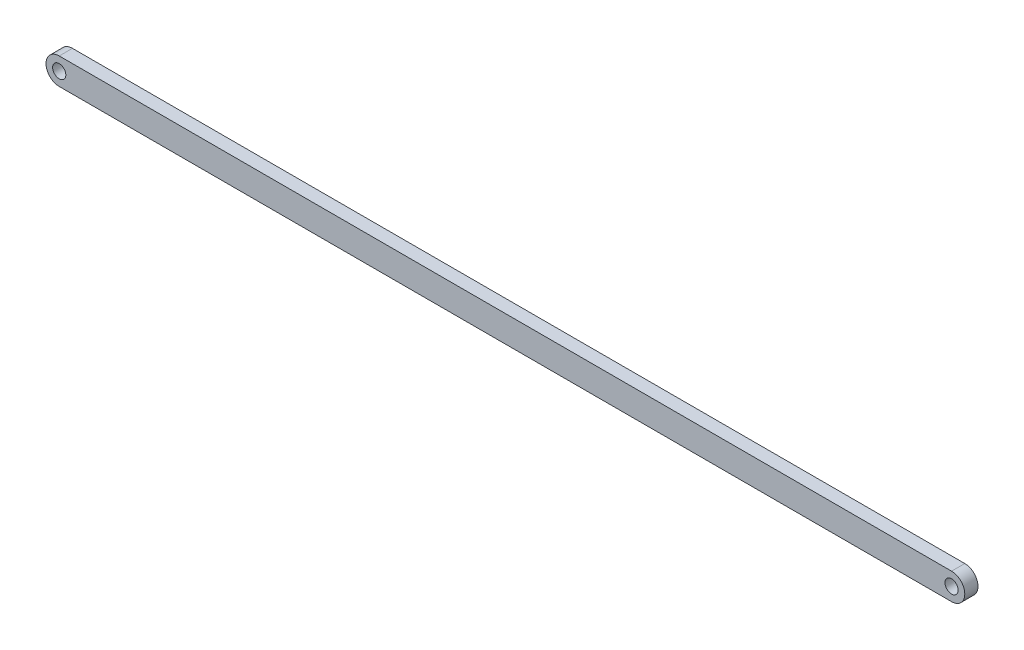
ISO-10303-21;
HEADER;
FILE_DESCRIPTION(('STEP AP214'),'2;1');
FILE_NAME('part.step','',(''),(''),'','','');
FILE_SCHEMA(('AUTOMOTIVE_DESIGN { 1 0 10303 214 1 1 1 1 }'));
ENDSEC;
DATA;
#1=APPLICATION_CONTEXT('core data for automotive mechanical design processes');
#2=APPLICATION_PROTOCOL_DEFINITION('international standard','automotive_design',2000,#1);
#3=PRODUCT_CONTEXT('',#1,'mechanical');
#4=PRODUCT('Part','Part','',(#3));
#5=PRODUCT_RELATED_PRODUCT_CATEGORY('part','',(#4));
#6=PRODUCT_DEFINITION_FORMATION('','',#4);
#7=PRODUCT_DEFINITION_CONTEXT('part definition',#1,'design');
#8=PRODUCT_DEFINITION('design','',#6,#7);
#9=PRODUCT_DEFINITION_SHAPE('','',#8);
#10=(LENGTH_UNIT() NAMED_UNIT(*) SI_UNIT(.MILLI.,.METRE.));
#11=(NAMED_UNIT(*) PLANE_ANGLE_UNIT() SI_UNIT($,.RADIAN.));
#12=(NAMED_UNIT(*) SI_UNIT($,.STERADIAN.) SOLID_ANGLE_UNIT());
#13=UNCERTAINTY_MEASURE_WITH_UNIT(LENGTH_MEASURE(1.E-05),#10,'distance_accuracy_value','');
#14=(GEOMETRIC_REPRESENTATION_CONTEXT(3) GLOBAL_UNCERTAINTY_ASSIGNED_CONTEXT((#13)) GLOBAL_UNIT_ASSIGNED_CONTEXT((#10,
#11,#12)) REPRESENTATION_CONTEXT('',''));
#15=CARTESIAN_POINT('',(0.,0.,0.));
#16=DIRECTION('',(0.,0.,1.));
#17=DIRECTION('',(1.,0.,0.));
#18=AXIS2_PLACEMENT_3D('',#15,#16,#17);
#19=CARTESIAN_POINT('',(168.72,0.,5.));
#20=DIRECTION('',(0.,0.,-1.));
#21=DIRECTION('',(-1.,0.,0.));
#22=AXIS2_PLACEMENT_3D('',#19,#20,#21);
#23=PLANE('',#22);
#24=CARTESIAN_POINT('',(168.72,0.,5.));
#25=DIRECTION('',(0.,0.,1.));
#26=DIRECTION('',(-1.,0.,0.));
#27=AXIS2_PLACEMENT_3D('',#24,#25,#26);
#28=CIRCLE('',#27,5.);
#29=CARTESIAN_POINT('',(168.72,-5.,5.));
#30=VERTEX_POINT('',#29);
#31=CARTESIAN_POINT('',(168.72,5.,5.));
#32=VERTEX_POINT('',#31);
#33=EDGE_CURVE('E96',#30,#32,#28,.T.);
#34=ORIENTED_EDGE('',*,*,#33,.T.);
#35=DIRECTION('',(-1.,0.,0.));
#36=VECTOR('',#35,1.);
#37=CARTESIAN_POINT('',(-168.72,5.,5.));
#38=LINE('',#37,#36);
#39=CARTESIAN_POINT('',(-168.72,5.,5.));
#40=VERTEX_POINT('',#39);
#41=EDGE_CURVE('E91',#32,#40,#38,.T.);
#42=ORIENTED_EDGE('',*,*,#41,.T.);
#43=CARTESIAN_POINT('',(-168.72,0.,5.));
#44=DIRECTION('',(0.,0.,1.));
#45=DIRECTION('',(1.,0.,0.));
#46=AXIS2_PLACEMENT_3D('',#43,#44,#45);
#47=CIRCLE('',#46,5.);
#48=CARTESIAN_POINT('',(-168.72,-5.,5.));
#49=VERTEX_POINT('',#48);
#50=EDGE_CURVE('E94',#40,#49,#47,.T.);
#51=ORIENTED_EDGE('',*,*,#50,.T.);
#52=DIRECTION('',(1.,0.,0.));
#53=VECTOR('',#52,1.);
#54=CARTESIAN_POINT('',(-168.72,-5.,5.));
#55=LINE('',#54,#53);
#56=EDGE_CURVE('E61',#49,#30,#55,.T.);
#57=ORIENTED_EDGE('',*,*,#56,.T.);
#58=EDGE_LOOP('',(#34,#42,#51,#57));
#59=FACE_BOUND('',#58,.T.);
#60=CARTESIAN_POINT('',(-168.72,0.,5.));
#61=DIRECTION('',(0.,0.,1.));
#62=DIRECTION('',(1.,0.,0.));
#63=AXIS2_PLACEMENT_3D('',#60,#61,#62);
#64=CIRCLE('',#63,2.5);
#65=CARTESIAN_POINT('',(-166.22,0.,5.));
#66=VERTEX_POINT('',#65);
#67=EDGE_CURVE('E116',#66,#66,#64,.T.);
#68=ORIENTED_EDGE('',*,*,#67,.F.);
#69=EDGE_LOOP('',(#68));
#70=FACE_BOUND('',#69,.T.);
#71=CARTESIAN_POINT('',(168.72,0.,5.));
#72=DIRECTION('',(0.,0.,1.));
#73=DIRECTION('',(1.,0.,0.));
#74=AXIS2_PLACEMENT_3D('',#71,#72,#73);
#75=CIRCLE('',#74,2.5);
#76=CARTESIAN_POINT('',(171.22,0.,5.));
#77=VERTEX_POINT('',#76);
#78=EDGE_CURVE('E138',#77,#77,#75,.T.);
#79=ORIENTED_EDGE('',*,*,#78,.F.);
#80=EDGE_LOOP('',(#79));
#81=FACE_BOUND('',#80,.T.);
#82=ADVANCED_FACE('F43',(#59,#70,#81),#23,.F.);
#83=CARTESIAN_POINT('',(168.72,0.,0.));
#84=DIRECTION('',(0.,0.,-1.));
#85=DIRECTION('',(-1.,0.,0.));
#86=AXIS2_PLACEMENT_3D('',#83,#84,#85);
#87=PLANE('',#86);
#88=CARTESIAN_POINT('',(-168.72,0.,0.));
#89=DIRECTION('',(0.,0.,1.));
#90=DIRECTION('',(1.,0.,0.));
#91=AXIS2_PLACEMENT_3D('',#88,#89,#90);
#92=CIRCLE('',#91,2.5);
#93=CARTESIAN_POINT('',(-166.22,0.,0.));
#94=VERTEX_POINT('',#93);
#95=EDGE_CURVE('E134',#94,#94,#92,.T.);
#96=ORIENTED_EDGE('',*,*,#95,.T.);
#97=EDGE_LOOP('',(#96));
#98=FACE_BOUND('',#97,.T.);
#99=CARTESIAN_POINT('',(168.72,0.,0.));
#100=DIRECTION('',(0.,0.,1.));
#101=DIRECTION('',(-1.,0.,0.));
#102=AXIS2_PLACEMENT_3D('',#99,#100,#101);
#103=CIRCLE('',#102,5.);
#104=CARTESIAN_POINT('',(168.72,-5.,0.));
#105=VERTEX_POINT('',#104);
#106=CARTESIAN_POINT('',(168.72,5.,0.));
#107=VERTEX_POINT('',#106);
#108=EDGE_CURVE('E112',#105,#107,#103,.T.);
#109=ORIENTED_EDGE('',*,*,#108,.F.);
#110=DIRECTION('',(1.,0.,0.));
#111=VECTOR('',#110,1.);
#112=CARTESIAN_POINT('',(-168.72,-5.,0.));
#113=LINE('',#112,#111);
#114=CARTESIAN_POINT('',(-168.72,-5.,0.));
#115=VERTEX_POINT('',#114);
#116=EDGE_CURVE('E84',#115,#105,#113,.T.);
#117=ORIENTED_EDGE('',*,*,#116,.F.);
#118=CARTESIAN_POINT('',(-168.72,0.,0.));
#119=DIRECTION('',(0.,0.,1.));
#120=DIRECTION('',(1.,0.,0.));
#121=AXIS2_PLACEMENT_3D('',#118,#119,#120);
#122=CIRCLE('',#121,5.);
#123=CARTESIAN_POINT('',(-168.72,5.,0.));
#124=VERTEX_POINT('',#123);
#125=EDGE_CURVE('E78',#124,#115,#122,.T.);
#126=ORIENTED_EDGE('',*,*,#125,.F.);
#127=DIRECTION('',(-1.,0.,0.));
#128=VECTOR('',#127,1.);
#129=CARTESIAN_POINT('',(-168.72,5.,0.));
#130=LINE('',#129,#128);
#131=EDGE_CURVE('E101',#107,#124,#130,.T.);
#132=ORIENTED_EDGE('',*,*,#131,.F.);
#133=EDGE_LOOP('',(#109,#117,#126,#132));
#134=FACE_BOUND('',#133,.T.);
#135=CARTESIAN_POINT('',(168.72,0.,0.));
#136=DIRECTION('',(0.,0.,1.));
#137=DIRECTION('',(1.,0.,0.));
#138=AXIS2_PLACEMENT_3D('',#135,#136,#137);
#139=CIRCLE('',#138,2.5);
#140=CARTESIAN_POINT('',(171.22,0.,0.));
#141=VERTEX_POINT('',#140);
#142=EDGE_CURVE('E142',#141,#141,#139,.T.);
#143=ORIENTED_EDGE('',*,*,#142,.T.);
#144=EDGE_LOOP('',(#143));
#145=FACE_BOUND('',#144,.T.);
#146=ADVANCED_FACE('F129',(#98,#134,#145),#87,.T.);
#147=CARTESIAN_POINT('',(168.72,0.,5.));
#148=DIRECTION('',(0.,0.,-1.));
#149=DIRECTION('',(-1.,0.,0.));
#150=AXIS2_PLACEMENT_3D('',#147,#148,#149);
#151=CYLINDRICAL_SURFACE('',#150,5.);
#152=ORIENTED_EDGE('',*,*,#108,.T.);
#153=DIRECTION('',(0.,0.,-1.));
#154=VECTOR('',#153,1.);
#155=CARTESIAN_POINT('',(168.72,5.,5.));
#156=LINE('',#155,#154);
#157=EDGE_CURVE('E11',#32,#107,#156,.T.);
#158=ORIENTED_EDGE('',*,*,#157,.F.);
#159=ORIENTED_EDGE('',*,*,#33,.F.);
#160=DIRECTION('',(0.,0.,-1.));
#161=VECTOR('',#160,1.);
#162=CARTESIAN_POINT('',(168.72,-5.,5.));
#163=LINE('',#162,#161);
#164=EDGE_CURVE('E108',#30,#105,#163,.T.);
#165=ORIENTED_EDGE('',*,*,#164,.T.);
#166=EDGE_LOOP('',(#152,#158,#159,#165));
#167=FACE_BOUND('',#166,.T.);
#168=ADVANCED_FACE('F45',(#167),#151,.T.);
#169=CARTESIAN_POINT('',(-168.72,5.,5.));
#170=DIRECTION('',(0.,-1.,0.));
#171=DIRECTION('',(0.,0.,-1.));
#172=AXIS2_PLACEMENT_3D('',#169,#170,#171);
#173=PLANE('',#172);
#174=ORIENTED_EDGE('',*,*,#131,.T.);
#175=DIRECTION('',(0.,0.,-1.));
#176=VECTOR('',#175,1.);
#177=CARTESIAN_POINT('',(-168.72,5.,5.));
#178=LINE('',#177,#176);
#179=EDGE_CURVE('E53',#40,#124,#178,.T.);
#180=ORIENTED_EDGE('',*,*,#179,.F.);
#181=ORIENTED_EDGE('',*,*,#41,.F.);
#182=ORIENTED_EDGE('',*,*,#157,.T.);
#183=EDGE_LOOP('',(#174,#180,#181,#182));
#184=FACE_BOUND('',#183,.T.);
#185=ADVANCED_FACE('F100',(#184),#173,.F.);
#186=CARTESIAN_POINT('',(-168.72,0.,5.));
#187=DIRECTION('',(0.,0.,-1.));
#188=DIRECTION('',(-1.,0.,0.));
#189=AXIS2_PLACEMENT_3D('',#186,#187,#188);
#190=CYLINDRICAL_SURFACE('',#189,5.);
#191=ORIENTED_EDGE('',*,*,#125,.T.);
#192=DIRECTION('',(0.,0.,-1.));
#193=VECTOR('',#192,1.);
#194=CARTESIAN_POINT('',(-168.72,-5.,5.));
#195=LINE('',#194,#193);
#196=EDGE_CURVE('E103',#49,#115,#195,.T.);
#197=ORIENTED_EDGE('',*,*,#196,.F.);
#198=ORIENTED_EDGE('',*,*,#50,.F.);
#199=ORIENTED_EDGE('',*,*,#179,.T.);
#200=EDGE_LOOP('',(#191,#197,#198,#199));
#201=FACE_BOUND('',#200,.T.);
#202=ADVANCED_FACE('F104',(#201),#190,.T.);
#203=CARTESIAN_POINT('',(-168.72,-5.,5.));
#204=DIRECTION('',(0.,1.,0.));
#205=DIRECTION('',(0.,0.,1.));
#206=AXIS2_PLACEMENT_3D('',#203,#204,#205);
#207=PLANE('',#206);
#208=ORIENTED_EDGE('',*,*,#116,.T.);
#209=ORIENTED_EDGE('',*,*,#164,.F.);
#210=ORIENTED_EDGE('',*,*,#56,.F.);
#211=ORIENTED_EDGE('',*,*,#196,.T.);
#212=EDGE_LOOP('',(#208,#209,#210,#211));
#213=FACE_BOUND('',#212,.T.);
#214=ADVANCED_FACE('F126',(#213),#207,.F.);
#215=CARTESIAN_POINT('',(-168.72,0.,5.));
#216=DIRECTION('',(0.,0.,-1.));
#217=DIRECTION('',(-1.,0.,0.));
#218=AXIS2_PLACEMENT_3D('',#215,#216,#217);
#219=CYLINDRICAL_SURFACE('',#218,2.5);
#220=ORIENTED_EDGE('',*,*,#67,.T.);
#221=EDGE_LOOP('',(#220));
#222=FACE_BOUND('',#221,.T.);
#223=ORIENTED_EDGE('',*,*,#95,.F.);
#224=EDGE_LOOP('',(#223));
#225=FACE_BOUND('',#224,.T.);
#226=ADVANCED_FACE('F161',(#222,#225),#219,.F.);
#227=CARTESIAN_POINT('',(168.72,0.,5.));
#228=DIRECTION('',(0.,0.,-1.));
#229=DIRECTION('',(-1.,0.,0.));
#230=AXIS2_PLACEMENT_3D('',#227,#228,#229);
#231=CYLINDRICAL_SURFACE('',#230,2.5);
#232=ORIENTED_EDGE('',*,*,#78,.T.);
#233=EDGE_LOOP('',(#232));
#234=FACE_BOUND('',#233,.T.);
#235=ORIENTED_EDGE('',*,*,#142,.F.);
#236=EDGE_LOOP('',(#235));
#237=FACE_BOUND('',#236,.T.);
#238=ADVANCED_FACE('F150',(#234,#237),#231,.F.);
#239=CLOSED_SHELL('',(#82,#146,#168,#185,#202,#214,#226,#238));
#240=MANIFOLD_SOLID_BREP('B2',#239);
#241=ADVANCED_BREP_SHAPE_REPRESENTATION('',(#18,#240),#14);
#242=SHAPE_DEFINITION_REPRESENTATION(#9,#241);
ENDSEC;
END-ISO-10303-21;
